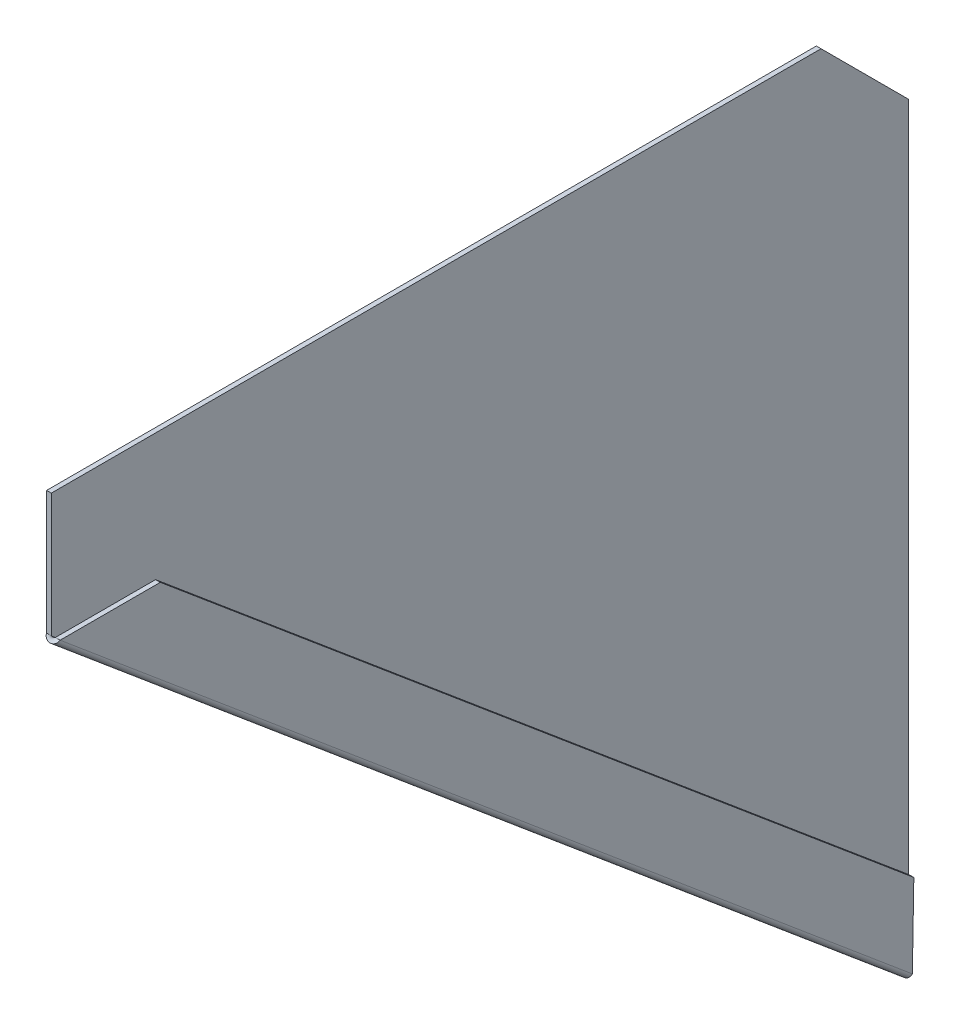
ISO-10303-21;
HEADER;
FILE_DESCRIPTION(('STEP AP214'),'2;1');
FILE_NAME('part.step','',(''),(''),'','','');
FILE_SCHEMA(('AUTOMOTIVE_DESIGN { 1 0 10303 214 1 1 1 1 }'));
ENDSEC;
DATA;
#1=APPLICATION_CONTEXT('core data for automotive mechanical design processes');
#2=APPLICATION_PROTOCOL_DEFINITION('international standard','automotive_design',2000,#1);
#3=PRODUCT_CONTEXT('',#1,'mechanical');
#4=PRODUCT('Part','Part','',(#3));
#5=PRODUCT_RELATED_PRODUCT_CATEGORY('part','',(#4));
#6=PRODUCT_DEFINITION_FORMATION('','',#4);
#7=PRODUCT_DEFINITION_CONTEXT('part definition',#1,'design');
#8=PRODUCT_DEFINITION('design','',#6,#7);
#9=PRODUCT_DEFINITION_SHAPE('','',#8);
#10=(LENGTH_UNIT() NAMED_UNIT(*) SI_UNIT(.MILLI.,.METRE.));
#11=(NAMED_UNIT(*) PLANE_ANGLE_UNIT() SI_UNIT($,.RADIAN.));
#12=(NAMED_UNIT(*) SI_UNIT($,.STERADIAN.) SOLID_ANGLE_UNIT());
#13=UNCERTAINTY_MEASURE_WITH_UNIT(LENGTH_MEASURE(1.E-05),#10,'distance_accuracy_value','');
#14=(GEOMETRIC_REPRESENTATION_CONTEXT(3) GLOBAL_UNCERTAINTY_ASSIGNED_CONTEXT((#13)) GLOBAL_UNIT_ASSIGNED_CONTEXT((#10,
#11,#12)) REPRESENTATION_CONTEXT('',''));
#15=CARTESIAN_POINT('',(0.,0.,0.));
#16=DIRECTION('',(0.,0.,1.));
#17=DIRECTION('',(1.,0.,0.));
#18=AXIS2_PLACEMENT_3D('',#15,#16,#17);
#19=CARTESIAN_POINT('',(0.0500000000000001,-98.1807021685568,-0.42423982239314));
#20=DIRECTION('',(0.,-0.642787609686543,-0.766044443118975));
#21=DIRECTION('',(1.,0.,0.));
#22=AXIS2_PLACEMENT_3D('',#19,#20,#21);
#23=CYLINDRICAL_SURFACE('',#22,0.66);
#24=DIRECTION('',(0.,-0.642787609686543,-0.766044443118975));
#25=VECTOR('',#24,1.);
#26=CARTESIAN_POINT('',(-0.61,-98.1807021685569,-0.424239822393022));
#27=LINE('',#26,#25);
#28=CARTESIAN_POINT('',(-0.61,-97.6594680818817,0.19694277298478));
#29=VERTEX_POINT('',#28);
#30=CARTESIAN_POINT('',(-0.61,-4.68466362937705,111.));
#31=VERTEX_POINT('',#30);
#32=EDGE_CURVE('E174',#29,#31,#27,.F.);
#33=ORIENTED_EDGE('',*,*,#32,.F.);
#34=CARTESIAN_POINT('',(0.05,-97.6594680818816,0.196942772984869));
#35=DIRECTION('',(0.,0.642787609686577,0.766044443118946));
#36=DIRECTION('',(0.,0.766044443118947,-0.642787609686577));
#37=AXIS2_PLACEMENT_3D('',#34,#35,#36);
#38=CIRCLE('',#37,0.66);
#39=CARTESIAN_POINT('',(0.71,-97.6594680818814,0.196942772984787));
#40=VERTEX_POINT('',#39);
#41=EDGE_CURVE('E142',#29,#40,#38,.T.);
#42=ORIENTED_EDGE('',*,*,#41,.T.);
#43=DIRECTION('',(0.,0.642787609686543,0.766044443118975));
#44=VECTOR('',#43,1.);
#45=CARTESIAN_POINT('',(0.71,-51.6106726382172,55.0757601776069));
#46=LINE('',#45,#44);
#47=CARTESIAN_POINT('',(0.71,-5.04064310787757,110.575760177607));
#48=VERTEX_POINT('',#47);
#49=EDGE_CURVE('E260',#40,#48,#46,.T.);
#50=ORIENTED_EDGE('',*,*,#49,.T.);
#51=CARTESIAN_POINT('',(-0.61,-4.68466362937643,111.));
#52=CARTESIAN_POINT('',(-0.6100002290786,-4.69479038362159,111.004732032463));
#53=CARTESIAN_POINT('',(-0.609734955302619,-4.70491712293474,111.009464052396));
#54=CARTESIAN_POINT('',(-0.608675046888262,-4.72515067993828,111.018911376037));
#55=CARTESIAN_POINT('',(-0.607880412249888,-4.73525749762867,111.023626679744));
#56=CARTESIAN_POINT('',(-0.605763426957518,-4.75543131962795,111.033023879765));
#57=CARTESIAN_POINT('',(-0.604441076303522,-4.76549832393683,111.037705776079));
#58=CARTESIAN_POINT('',(-0.601271916850145,-4.78557273618793,111.047019561417));
#59=CARTESIAN_POINT('',(-0.599425108050763,-4.79558014413014,111.051651450441));
#60=CARTESIAN_POINT('',(-0.595211462081707,-4.81551572078987,111.060848738885));
#61=CARTESIAN_POINT('',(-0.592844624912034,-4.82544388950738,111.065414138305));
#62=CARTESIAN_POINT('',(-0.587596629305016,-4.84520153667719,111.07446212618));
#63=CARTESIAN_POINT('',(-0.584715470867671,-4.85503101512948,111.078944714635));
#64=CARTESIAN_POINT('',(-0.578445772299144,-4.87457206823442,111.08781095851));
#65=CARTESIAN_POINT('',(-0.575057232167962,-4.88428364288708,111.09219461393));
#66=CARTESIAN_POINT('',(-0.56778093387397,-4.90356995896519,111.100847108059));
#67=CARTESIAN_POINT('',(-0.56389317571116,-4.91314470039065,111.105115946769));
#68=CARTESIAN_POINT('',(-0.555627807204121,-4.93213875021231,111.113523200391));
#69=CARTESIAN_POINT('',(-0.551250196859892,-4.94155805860852,111.117661615303));
#70=CARTESIAN_POINT('',(-0.542015670063483,-4.96022301702613,111.125792728449));
#71=CARTESIAN_POINT('',(-0.537158753611303,-4.96946866704753,111.129785426683));
#72=CARTESIAN_POINT('',(-0.526977315328988,-4.98776850172695,111.137610164635));
#73=CARTESIAN_POINT('',(-0.521652793498854,-4.99682268638497,111.141442204353));
#74=CARTESIAN_POINT('',(-0.510548971702005,-5.01472224460621,111.148931070476));
#75=CARTESIAN_POINT('',(-0.504769671735292,-5.02356761816944,111.152587896881));
#76=CARTESIAN_POINT('',(-0.492770216504601,-5.04103271151383,111.159712203687));
#77=CARTESIAN_POINT('',(-0.486550061240624,-5.04965243129499,111.163179684087));
#78=CARTESIAN_POINT('',(-0.473683880314394,-5.06664991800772,111.16991162234));
#79=CARTESIAN_POINT('',(-0.46703785465214,-5.07502768493929,111.173176080194));
#80=CARTESIAN_POINT('',(-0.453335943787267,-5.09152554977088,111.179488785911));
#81=CARTESIAN_POINT('',(-0.446280058584647,-5.09964564767091,111.182537033775));
#82=CARTESIAN_POINT('',(-0.431775426884523,-5.11561307900479,111.18840465294));
#83=CARTESIAN_POINT('',(-0.424326680387018,-5.12346041243864,111.191224024241));
#84=CARTESIAN_POINT('',(-0.409054270779871,-5.13886787651896,111.19662177509));
#85=CARTESIAN_POINT('',(-0.401230607670227,-5.14642800716543,111.199200154638));
#86=CARTESIAN_POINT('',(-0.385227212728506,-5.16124731924654,111.204104387361));
#87=CARTESIAN_POINT('',(-0.377047480896428,-5.16850650068117,111.206430240536));
#88=CARTESIAN_POINT('',(-0.360351654200277,-5.18271089292706,111.210818494253));
#89=CARTESIAN_POINT('',(-0.351835559336204,-5.18965610373832,111.212880894794));
#90=CARTESIAN_POINT('',(-0.334487522594516,-5.20322028970873,111.21673195166));
#91=CARTESIAN_POINT('',(-0.3256555807169,-5.20983926486789,111.218520607986));
#92=CARTESIAN_POINT('',(-0.307697126869697,-5.2227395004356,111.221814544315));
#93=CARTESIAN_POINT('',(-0.29857061490011,-5.22902076084415,111.223319824318));
#94=CARTESIAN_POINT('',(-0.280045007435681,-5.24123490139656,111.226038058572));
#95=CARTESIAN_POINT('',(-0.270645911940838,-5.24716778154042,111.227251012824));
#96=CARTESIAN_POINT('',(-0.251597780670221,-5.25867533532795,111.229376350384));
#97=CARTESIAN_POINT('',(-0.241948744894446,-5.26425000897163,111.230288733694));
#98=CARTESIAN_POINT('',(-0.222423978434286,-5.27503218647409,111.231805408281));
#99=CARTESIAN_POINT('',(-0.212548247749902,-5.28023969033287,111.232409699559));
#100=CARTESIAN_POINT('',(-0.192593882972773,-5.29027944952509,111.233303411216));
#101=CARTESIAN_POINT('',(-0.182515248880028,-5.29511170485852,111.233592831595));
#102=CARTESIAN_POINT('',(-0.162179357598472,-5.30439379226605,111.233850781137));
#103=CARTESIAN_POINT('',(-0.151922100409662,-5.30884362434013,111.2338193103));
#104=CARTESIAN_POINT('',(-0.131253673566991,-5.31735461178621,111.233430230149));
#105=CARTESIAN_POINT('',(-0.120842503913131,-5.32141576715821,111.233072620835));
#106=CARTESIAN_POINT('',(-0.0998913335599486,-5.32914408411346,111.232026802163));
#107=CARTESIAN_POINT('',(-0.0893513328606269,-5.3328112456967,111.231338592806));
#108=CARTESIAN_POINT('',(-0.0681678922014206,-5.33974720715347,111.229627908928));
#109=CARTESIAN_POINT('',(-0.057524452241536,-5.343016007027,111.228605434407));
#110=CARTESIAN_POINT('',(-0.0361597740403055,-5.34915183683146,111.226223360355));
#111=CARTESIAN_POINT('',(-0.0254385357989597,-5.3520188667624,111.224863760823));
#112=CARTESIAN_POINT('',(-0.00394408943681063,-5.35734871634793,111.221805389067));
#113=CARTESIAN_POINT('',(0.00682911868399253,-5.35981153600252,111.220106616841));
#114=CARTESIAN_POINT('',(0.0284015512030749,-5.3643314984795,111.21636866911));
#115=CARTESIAN_POINT('',(0.0392007756013541,-5.36638864130189,111.214329493605));
#116=CARTESIAN_POINT('',(0.0607992243979131,-5.37009676086962,111.209910328788));
#117=CARTESIAN_POINT('',(0.0715984487961929,-5.37174773761496,111.207530339477));
#118=CARTESIAN_POINT('',(0.0931708813152771,-5.37464401427344,111.202429957575));
#119=CARTESIAN_POINT('',(0.103944089436082,-5.37588931418658,111.199709564984));
#120=CARTESIAN_POINT('',(0.125438535798231,-5.37797570373648,111.193929607107));
#121=CARTESIAN_POINT('',(0.136159774039577,-5.37881679337324,111.190870041822));
#122=CARTESIAN_POINT('',(0.157524452240813,-5.38009720270424,111.184413786241));
#123=CARTESIAN_POINT('',(0.168167892200703,-5.38053652239846,111.181017095946));
#124=CARTESIAN_POINT('',(0.189351332859912,-5.38101680007715,111.17388945019));
#125=CARTESIAN_POINT('',(0.199891333559232,-5.3810577580616,111.170158494731));
#126=CARTESIAN_POINT('',(0.22084250391242,-5.38074568024181,111.162365983769));
#127=CARTESIAN_POINT('',(0.231253673566288,-5.38039264443755,111.158304428267));
#128=CARTESIAN_POINT('',(0.251922100408966,-5.37929789612692,111.149855178785));
#129=CARTESIAN_POINT('',(0.262179357597776,-5.37855618362054,111.145467484805));
#130=CARTESIAN_POINT('',(0.28251524887934,-5.37669033534847,111.13637120563));
#131=CARTESIAN_POINT('',(0.292593882972095,-5.37556619958278,111.131662620435));
#132=CARTESIAN_POINT('',(0.312548247749233,-5.37294267952603,111.121930579145));
#133=CARTESIAN_POINT('',(0.322423978433616,-5.37144329523496,111.11690712305));
#134=CARTESIAN_POINT('',(0.341948744893785,-5.36807735686794,111.106552118829));
#135=CARTESIAN_POINT('',(0.35159778066957,-5.36621080279198,111.101220570703));
#136=CARTESIAN_POINT('',(0.370645911940203,-5.36211948813989,111.09025690351));
#137=CARTESIAN_POINT('',(0.380045007435049,-5.35989472756377,111.084624784442));
#138=CARTESIAN_POINT('',(0.398570614899487,-5.35509682614682,111.073068220554));
#139=CARTESIAN_POINT('',(0.407697126869078,-5.35252368530599,111.067143775734));
#140=CARTESIAN_POINT('',(0.425655580716296,-5.34703968887372,111.055011509772));
#141=CARTESIAN_POINT('',(0.434487522593923,-5.34412883328228,111.04880368863));
#142=CARTESIAN_POINT('',(0.451835559335625,-5.3379808864473,111.03611430213));
#143=CARTESIAN_POINT('',(0.460351654199701,-5.33474379520376,111.029632736773));
#144=CARTESIAN_POINT('',(0.477047480895865,-5.32795564209333,111.016406153423));
#145=CARTESIAN_POINT('',(0.485227212727953,-5.32440458022642,111.009661135431));
#146=CARTESIAN_POINT('',(0.501230607669694,-5.31700150728077,110.995918573075));
#147=CARTESIAN_POINT('',(0.509054270779347,-5.31314949620201,110.98892102871));
#148=CARTESIAN_POINT('',(0.524326680386511,-5.30515827125714,110.974684948228));
#149=CARTESIAN_POINT('',(0.531775426884022,-5.30101905739102,110.96744641211));
#150=CARTESIAN_POINT('',(0.546280058584163,-5.29246786519259,110.952740463312));
#151=CARTESIAN_POINT('',(0.553335943786792,-5.28805588686027,110.945273050632));
#152=CARTESIAN_POINT('',(0.567037854651685,-5.27897426116411,110.930122015281));
#153=CARTESIAN_POINT('',(0.573683880313948,-5.27430461380028,110.922438392612));
#154=CARTESIAN_POINT('',(0.586550061240198,-5.26472336622301,110.906868124725));
#155=CARTESIAN_POINT('',(0.592770216504185,-5.25981176600958,110.898981479508));
#156=CARTESIAN_POINT('',(0.604769671734895,-5.24976291180064,110.88301884307));
#157=CARTESIAN_POINT('',(0.610548971701618,-5.24462565780512,110.874942851848));
#158=CARTESIAN_POINT('',(0.621652793498487,-5.2341423387193,110.858615656091));
#159=CARTESIAN_POINT('',(0.626977315328634,-5.22879627362899,110.850364451556));
#160=CARTESIAN_POINT('',(0.637158753610969,-5.21791267808502,110.833701383971));
#161=CARTESIAN_POINT('',(0.642015670063157,-5.21237514763134,110.825289520921));
#162=CARTESIAN_POINT('',(0.651250196859588,-5.20112642834919,110.808320078142));
#163=CARTESIAN_POINT('',(0.65562780720383,-5.19541523952071,110.799762498413));
#164=CARTESIAN_POINT('',(0.663893175710892,-5.18383742883448,110.782516915158));
#165=CARTESIAN_POINT('',(0.667780933873713,-5.17797080697673,110.773828911632));
#166=CARTESIAN_POINT('',(0.675057232167726,-5.16610073003404,110.756338087869));
#167=CARTESIAN_POINT('',(0.678445772298918,-5.1600972749491,110.747535267632));
#168=CARTESIAN_POINT('',(0.684715470867469,-5.14797246097958,110.729830694124));
#169=CARTESIAN_POINT('',(0.687596629304827,-5.141851102095,110.720928940853));
#170=CARTESIAN_POINT('',(0.692844624911869,-5.12950969406065,110.703042623345));
#171=CARTESIAN_POINT('',(0.695211462081552,-5.12328964491087,110.694058059108));
#172=CARTESIAN_POINT('',(0.69942510805063,-5.11077030738658,110.676022441031));
#173=CARTESIAN_POINT('',(0.701271916850025,-5.10447101901207,110.66697138719));
#174=CARTESIAN_POINT('',(0.704441076303427,-5.09181284589641,110.648819272219));
#175=CARTESIAN_POINT('',(0.705763426957434,-5.08545396115526,110.639718211089));
#176=CARTESIAN_POINT('',(0.707880412249828,-5.07269637829141,110.621482681435));
#177=CARTESIAN_POINT('',(0.708675046888214,-5.06629768016873,110.612348212911));
#178=CARTESIAN_POINT('',(0.709734955302595,-5.0534803623006,110.594062559637));
#179=CARTESIAN_POINT('',(0.710000229078589,-5.04706174255517,110.584911374887));
#180=CARTESIAN_POINT('',(0.71,-5.04064310787776,110.575760177607));
#181=B_SPLINE_CURVE_WITH_KNOTS('',3,(#51,#52,#53,#54,#55,#56,#57,#58,#59,#60,#61,#62,#63,#64,
#65,#66,#67,#68,#69,#70,#71,#72,#73,#74,#75,#76,#77,#78,#79,#80,#81,#82,#83,#84,#85,#86,#87,#88,
#89,#90,#91,#92,#93,#94,#95,#96,#97,#98,#99,#100,#101,#102,#103,#104,#105,#106,#107,#108,#109,
#110,#111,#112,#113,#114,#115,#116,#117,#118,#119,#120,#121,#122,#123,#124,#125,#126,#127,#128,
#129,#130,#131,#132,#133,#134,#135,#136,#137,#138,#139,#140,#141,#142,#143,#144,#145,#146,#147,
#148,#149,#150,#151,#152,#153,#154,#155,#156,#157,#158,#159,#160,#161,#162,#163,#164,#165,#166,
#167,#168,#169,#170,#171,#172,#173,#174,#175,#176,#177,#178,#179,#180),.UNSPECIFIED.,.F.,.F.,(4,
2,2,2,2,2,2,2,2,2,2,2,2,2,2,2,2,2,2,2,2,2,2,2,2,2,2,2,2,2,2,2,2,2,2,2,2,2,2,2,2,2,2,2,2,2,2,2,2,
2,2,2,2,2,2,2,2,2,2,2,2,2,2,2,4),(0.,0.0335302353550578,0.0670604707101002,0.100590706065136,
0.134120941420187,0.167651176775227,0.201181412130282,0.23471164748533,0.268241882840361,
0.30177211819542,0.335302353550455,0.3688325889055,0.402362824260545,0.435893059615595,
0.46942329497064,0.50295353032569,0.536483765680734,0.570014001035782,0.603544236390835,
0.637074471745877,0.670604707100919,0.704134942455965,0.737665177811005,0.77119541316606,
0.804725648521099,0.838255883876155,0.871786119231193,0.905316354586247,0.938846589941286,
0.972376825296341,1.00590706065138,1.03943729600642,1.07296753136147,1.10649776671652,
1.14002800207156,1.1735582374266,1.20708847278166,1.2406187081367,1.27414894349175,
1.30767917884679,1.34120941420184,1.37473964955689,1.40826988491193,1.44180012026697,
1.47533035562203,1.50886059097707,1.54239082633212,1.57592106168717,1.6094512970422,
1.64298153239725,1.6765117677523,1.71004200310734,1.74357223846239,1.77710247381744,
1.81063270917249,1.84416294452754,1.87769317988258,1.91122341523762,1.94475365059268,
1.97828388594771,2.01181412130277,2.04534435665781,2.07887459201285,2.11240482736789,
2.14593506272294),.UNSPECIFIED.);
#182=EDGE_CURVE('E243',#31,#48,#181,.T.);
#183=ORIENTED_EDGE('',*,*,#182,.F.);
#184=EDGE_LOOP('',(#33,#42,#50,#183));
#185=FACE_BOUND('',#184,.T.);
#186=ADVANCED_FACE('F42',(#185),#23,.T.);
#187=CARTESIAN_POINT('',(0.0500000000000001,-98.1807021685568,-0.42423982239314));
#188=DIRECTION('',(0.,-0.642787609686543,-0.766044443118975));
#189=DIRECTION('',(1.,0.,0.));
#190=AXIS2_PLACEMENT_3D('',#187,#188,#189);
#191=CYLINDRICAL_SURFACE('',#190,0.05);
#192=CARTESIAN_POINT('',(0.05,-97.6594680818816,0.196942772984862));
#193=DIRECTION('',(0.,0.642787609686543,0.766044443118975));
#194=DIRECTION('',(0.,-0.766044443118975,0.642787609686543));
#195=AXIS2_PLACEMENT_3D('',#192,#193,#194);
#196=CIRCLE('',#195,0.05);
#197=CARTESIAN_POINT('',(0.,-97.6594680818815,0.196942772984808));
#198=VERTEX_POINT('',#197);
#199=CARTESIAN_POINT('',(0.1,-97.6594680818814,0.196942772984759));
#200=VERTEX_POINT('',#199);
#201=EDGE_CURVE('E139',#198,#200,#196,.T.);
#202=ORIENTED_EDGE('',*,*,#201,.F.);
#203=DIRECTION('',(0.,-0.642787609686543,-0.766044443118975));
#204=VECTOR('',#203,1.);
#205=CARTESIAN_POINT('',(0.,-98.1807021685568,-0.424239822393132));
#206=LINE('',#205,#204);
#207=CARTESIAN_POINT('',(0.,-4.68466362937694,111.));
#208=VERTEX_POINT('',#207);
#209=EDGE_CURVE('E154',#198,#208,#206,.F.);
#210=ORIENTED_EDGE('',*,*,#209,.T.);
#211=CARTESIAN_POINT('',(0.,-4.68466362937682,111.));
#212=CARTESIAN_POINT('',(-4.36261635787755E-06,-4.6945873870513,110.993265728248));
#213=CARTESIAN_POINT('',(0.000321140730506063,-4.70450999333328,110.986530490363));
#214=CARTESIAN_POINT('',(0.00160033122915463,-4.72425948594163,110.972979696014));
#215=CARTESIAN_POINT('',(0.00255401838093844,-4.734086372268,110.96616413955));
#216=CARTESIAN_POINT('',(0.00505802836790537,-4.75355100779452,110.952374321728));
#217=CARTESIAN_POINT('',(0.00660835120308924,-4.76318875699467,110.945400060371));
#218=CARTESIAN_POINT('',(0.0102446875666167,-4.78218995517346,110.931221372442));
#219=CARTESIAN_POINT('',(0.0123307010949606,-4.7915534041521,110.92401694587));
#220=CARTESIAN_POINT('',(0.0169586207863325,-4.80993111589391,110.909315090701));
#221=CARTESIAN_POINT('',(0.0195005269493599,-4.81894537865709,110.901817662105));
#222=CARTESIAN_POINT('',(0.0249424497486277,-4.83656332177222,110.886478285362));
#223=CARTESIAN_POINT('',(0.0278424663848683,-4.84516700212417,110.878636337215));
#224=CARTESIAN_POINT('',(0.0338891903785647,-4.86191814370423,110.862569627624));
#225=CARTESIAN_POINT('',(0.0370358977360204,-4.87006560493234,110.854344866179));
#226=CARTESIAN_POINT('',(0.0434550700623086,-4.88587620890409,110.837488951828));
#227=CARTESIAN_POINT('',(0.0467275350311411,-4.89353935164775,110.828857798921));
#228=CARTESIAN_POINT('',(0.0532724649688044,-4.90837182991862,110.811181139655));
#229=CARTESIAN_POINT('',(0.0565449299376353,-4.91554116544585,110.802135633295));
#230=CARTESIAN_POINT('',(0.0629641022639247,-4.92939551801583,110.783638229114));
#231=CARTESIAN_POINT('',(0.0661108096213832,-4.93608053505858,110.774186331292));
#232=CARTESIAN_POINT('',(0.072157533615083,-4.94899435002026,110.754899722351));
#233=CARTESIAN_POINT('',(0.075057550251324,-4.95522314793917,110.745065011231));
#234=CARTESIAN_POINT('',(0.0804994730505953,-4.96727016136577,110.725051069441));
#235=CARTESIAN_POINT('',(0.083041379213626,-4.97308837687346,110.714871838771));
#236=CARTESIAN_POINT('',(0.0876692989050037,-4.98437562167338,110.694220375407));
#237=CARTESIAN_POINT('',(0.0897553124333498,-4.98984465096562,110.683748142712));
#238=CARTESIAN_POINT('',(0.0933916487968828,-5.00050840932857,110.662573512109));
#239=CARTESIAN_POINT('',(0.09494197163207,-5.00570313839929,110.651871114199));
#240=CARTESIAN_POINT('',(0.0974459816190437,-5.01590345941449,110.630307613488));
#241=CARTESIAN_POINT('',(0.098399668770831,-5.02090905135899,110.619446510686));
#242=CARTESIAN_POINT('',(0.0996788592694868,-5.03082451529237,110.597643986503));
#243=CARTESIAN_POINT('',(0.100004362616354,-5.03573438728125,110.586702565121));
#244=CARTESIAN_POINT('',(0.1,-5.04064310787764,110.575760177607));
#245=B_SPLINE_CURVE_WITH_KNOTS('',3,(#211,#212,#213,#214,#215,#216,#217,#218,#219,#220,#221,
#222,#223,#224,#225,#226,#227,#228,#229,#230,#231,#232,#233,#234,#235,#236,#237,#238,#239,#240,
#241,#242,#243,#244),.UNSPECIFIED.,.F.,.F.,(4,2,2,2,2,2,2,2,2,2,2,2,2,2,2,2,4),(0.,
0.0359739302906176,0.0719478605811885,0.107921790871804,0.143895721162437,0.179869651453019,
0.215843581743635,0.251817512034245,0.287791442324852,0.323765372615469,0.359739302906064,
0.395713233196684,0.431687163487257,0.467661093777897,0.50363502406852,0.539608954359092,
0.575582884649711),.UNSPECIFIED.);
#246=CARTESIAN_POINT('',(0.1,-5.04064310787765,110.575760177607));
#247=VERTEX_POINT('',#246);
#248=EDGE_CURVE('E171',#208,#247,#245,.T.);
#249=ORIENTED_EDGE('',*,*,#248,.T.);
#250=DIRECTION('',(0.,0.642787609686543,0.766044443118975));
#251=VECTOR('',#250,1.);
#252=CARTESIAN_POINT('',(0.1,-51.6106726382172,55.0757601776069));
#253=LINE('',#252,#251);
#254=EDGE_CURVE('E156',#200,#247,#253,.T.);
#255=ORIENTED_EDGE('',*,*,#254,.F.);
#256=EDGE_LOOP('',(#202,#210,#249,#255));
#257=FACE_BOUND('',#256,.T.);
#258=ADVANCED_FACE('F151',(#257),#191,.F.);
#259=CARTESIAN_POINT('',(-0.61,-98.6862915010153,0.));
#260=DIRECTION('',(0.,0.,-1.));
#261=DIRECTION('',(-1.,0.,0.));
#262=AXIS2_PLACEMENT_3D('',#259,#260,#261);
#263=PLANE('',#262);
#264=DIRECTION('',(0.,1.,0.));
#265=VECTOR('',#264,1.);
#266=CARTESIAN_POINT('',(0.,-98.6862915010153,0.));
#267=LINE('',#266,#265);
#268=CARTESIAN_POINT('',(0.,-86.9376258970247,0.));
#269=VERTEX_POINT('',#268);
#270=CARTESIAN_POINT('',(0.,0.,0.));
#271=VERTEX_POINT('',#270);
#272=EDGE_CURVE('E267',#269,#271,#267,.T.);
#273=ORIENTED_EDGE('',*,*,#272,.F.);
#274=DIRECTION('',(-1.,0.,0.));
#275=VECTOR('',#274,1.);
#276=CARTESIAN_POINT('',(0.,-86.9376258970247,0.));
#277=LINE('',#276,#275);
#278=CARTESIAN_POINT('',(-0.61,-86.9376258970247,0.));
#279=VERTEX_POINT('',#278);
#280=EDGE_CURVE('E284',#279,#269,#277,.F.);
#281=ORIENTED_EDGE('',*,*,#280,.F.);
#282=DIRECTION('',(0.,1.,0.));
#283=VECTOR('',#282,1.);
#284=CARTESIAN_POINT('',(-0.61,-98.6862915010153,0.));
#285=LINE('',#284,#283);
#286=CARTESIAN_POINT('',(-0.61,0.,0.));
#287=VERTEX_POINT('',#286);
#288=EDGE_CURVE('E82',#279,#287,#285,.T.);
#289=ORIENTED_EDGE('',*,*,#288,.T.);
#290=DIRECTION('',(1.,0.,0.));
#291=VECTOR('',#290,1.);
#292=CARTESIAN_POINT('',(-0.61,0.,0.));
#293=LINE('',#292,#291);
#294=EDGE_CURVE('E46',#287,#271,#293,.T.);
#295=ORIENTED_EDGE('',*,*,#294,.T.);
#296=EDGE_LOOP('',(#273,#281,#289,#295));
#297=FACE_BOUND('',#296,.T.);
#298=ADVANCED_FACE('F44',(#297),#263,.T.);
#299=CARTESIAN_POINT('',(-0.61,0.,0.));
#300=DIRECTION('',(1.,0.,0.));
#301=DIRECTION('',(0.,0.,-1.));
#302=AXIS2_PLACEMENT_3D('',#299,#300,#301);
#303=PLANE('',#302);
#304=DIRECTION('',(0.,0.999840191284591,-0.0178771332151613));
#305=VECTOR('',#304,1.);
#306=CARTESIAN_POINT('',(-0.61,-0.0276909646369503,-1.54871248349723));
#307=LINE('',#306,#305);
#308=CARTESIAN_POINT('',(-0.61,-86.9332970360809,0.00515893558170207));
#309=VERTEX_POINT('',#308);
#310=EDGE_CURVE('E290',#29,#309,#307,.T.);
#311=ORIENTED_EDGE('',*,*,#310,.F.);
#312=ORIENTED_EDGE('',*,*,#32,.T.);
#313=DIRECTION('',(0.,-1.,0.));
#314=VECTOR('',#313,1.);
#315=CARTESIAN_POINT('',(-0.61,11.3137084989847,111.));
#316=LINE('',#315,#314);
#317=CARTESIAN_POINT('',(-0.61,11.3137084989847,111.));
#318=VERTEX_POINT('',#317);
#319=EDGE_CURVE('E273',#318,#31,#316,.T.);
#320=ORIENTED_EDGE('',*,*,#319,.F.);
#321=DIRECTION('',(0.,0.,1.));
#322=VECTOR('',#321,1.);
#323=CARTESIAN_POINT('',(-0.61,11.3137084989847,11.3137084989848));
#324=LINE('',#323,#322);
#325=CARTESIAN_POINT('',(-0.61,11.3137084989847,11.3137084989848));
#326=VERTEX_POINT('',#325);
#327=EDGE_CURVE('E271',#326,#318,#324,.T.);
#328=ORIENTED_EDGE('',*,*,#327,.F.);
#329=DIRECTION('',(0.,0.707106781186546,0.707106781186549));
#330=VECTOR('',#329,1.);
#331=CARTESIAN_POINT('',(-0.61,0.,0.));
#332=LINE('',#331,#330);
#333=EDGE_CURVE('E269',#287,#326,#332,.T.);
#334=ORIENTED_EDGE('',*,*,#333,.F.);
#335=ORIENTED_EDGE('',*,*,#288,.F.);
#336=DIRECTION('',(0.,-0.642787609686543,-0.766044443118975));
#337=VECTOR('',#336,1.);
#338=CARTESIAN_POINT('',(-0.61,-51.0170931023658,42.8084240059325));
#339=LINE('',#338,#337);
#340=EDGE_CURVE('E166',#309,#279,#339,.T.);
#341=ORIENTED_EDGE('',*,*,#340,.F.);
#342=EDGE_LOOP('',(#311,#312,#320,#328,#334,#335,#341));
#343=FACE_BOUND('',#342,.T.);
#344=ADVANCED_FACE('F221',(#343),#303,.F.);
#345=CARTESIAN_POINT('',(0.,0.,0.));
#346=DIRECTION('',(1.,0.,0.));
#347=DIRECTION('',(0.,0.,-1.));
#348=AXIS2_PLACEMENT_3D('',#345,#346,#347);
#349=PLANE('',#348);
#350=ORIENTED_EDGE('',*,*,#209,.F.);
#351=DIRECTION('',(0.,0.999840191284591,-0.0178771332151613));
#352=VECTOR('',#351,1.);
#353=CARTESIAN_POINT('',(0.,-0.0276909646369503,-1.54871248349723));
#354=LINE('',#353,#352);
#355=CARTESIAN_POINT('',(0.,-86.9332970360809,0.00515893558170207));
#356=VERTEX_POINT('',#355);
#357=EDGE_CURVE('E160',#198,#356,#354,.T.);
#358=ORIENTED_EDGE('',*,*,#357,.T.);
#359=DIRECTION('',(0.,-0.642787609686543,-0.766044443118975));
#360=VECTOR('',#359,1.);
#361=CARTESIAN_POINT('',(0.,-51.0170931023658,42.8084240059325));
#362=LINE('',#361,#360);
#363=EDGE_CURVE('E165',#356,#269,#362,.T.);
#364=ORIENTED_EDGE('',*,*,#363,.T.);
#365=ORIENTED_EDGE('',*,*,#272,.T.);
#366=DIRECTION('',(0.,0.707106781186546,0.707106781186549));
#367=VECTOR('',#366,1.);
#368=CARTESIAN_POINT('',(0.,0.,0.));
#369=LINE('',#368,#367);
#370=CARTESIAN_POINT('',(0.,11.3137084989847,11.3137084989848));
#371=VERTEX_POINT('',#370);
#372=EDGE_CURVE('E276',#271,#371,#369,.T.);
#373=ORIENTED_EDGE('',*,*,#372,.T.);
#374=DIRECTION('',(0.,0.,1.));
#375=VECTOR('',#374,1.);
#376=CARTESIAN_POINT('',(0.,11.3137084989847,11.3137084989848));
#377=LINE('',#376,#375);
#378=CARTESIAN_POINT('',(0.,11.3137084989847,111.));
#379=VERTEX_POINT('',#378);
#380=EDGE_CURVE('E279',#371,#379,#377,.T.);
#381=ORIENTED_EDGE('',*,*,#380,.T.);
#382=DIRECTION('',(0.,-1.,0.));
#383=VECTOR('',#382,1.);
#384=CARTESIAN_POINT('',(0.,11.3137084989847,111.));
#385=LINE('',#384,#383);
#386=EDGE_CURVE('E169',#379,#208,#385,.T.);
#387=ORIENTED_EDGE('',*,*,#386,.T.);
#388=EDGE_LOOP('',(#350,#358,#364,#365,#373,#381,#387));
#389=FACE_BOUND('',#388,.T.);
#390=ADVANCED_FACE('F168',(#389),#349,.T.);
#391=CARTESIAN_POINT('',(0.71,-45.221861982605,49.7149115128211));
#392=DIRECTION('',(0.,-0.766044443118975,0.642787609686543));
#393=DIRECTION('',(0.,-0.642787609686543,-0.766044443118975));
#394=AXIS2_PLACEMENT_3D('',#391,#392,#393);
#395=PLANE('',#394);
#396=DIRECTION('',(0.,-0.642787609686543,-0.766044443118975));
#397=VECTOR('',#396,1.);
#398=CARTESIAN_POINT('',(0.71,-45.221861982605,49.7149115128211));
#399=LINE('',#398,#397);
#400=CARTESIAN_POINT('',(0.71,-5.04064310787756,97.6010234615913));
#401=VERTEX_POINT('',#400);
#402=CARTESIAN_POINT('',(0.71,-86.9332970360809,0.00515893558170066));
#403=VERTEX_POINT('',#402);
#404=EDGE_CURVE('E256',#401,#403,#399,.T.);
#405=ORIENTED_EDGE('',*,*,#404,.T.);
#406=DIRECTION('',(-1.,0.,0.));
#407=VECTOR('',#406,1.);
#408=CARTESIAN_POINT('',(0.71,-86.9332970360809,0.00515893558170066));
#409=LINE('',#408,#407);
#410=CARTESIAN_POINT('',(0.1,-86.9332970360809,0.00515893558170055));
#411=VERTEX_POINT('',#410);
#412=EDGE_CURVE('E297',#411,#403,#409,.F.);
#413=ORIENTED_EDGE('',*,*,#412,.F.);
#414=DIRECTION('',(0.,-0.642787609686543,-0.766044443118975));
#415=VECTOR('',#414,1.);
#416=CARTESIAN_POINT('',(0.1,-45.221861982605,49.7149115128211));
#417=LINE('',#416,#415);
#418=CARTESIAN_POINT('',(0.1,-5.04064310787756,97.6010234615913));
#419=VERTEX_POINT('',#418);
#420=EDGE_CURVE('E262',#419,#411,#417,.T.);
#421=ORIENTED_EDGE('',*,*,#420,.F.);
#422=DIRECTION('',(1.,0.,0.));
#423=VECTOR('',#422,1.);
#424=CARTESIAN_POINT('',(0.1,-5.04064310787756,97.6010234615913));
#425=LINE('',#424,#423);
#426=EDGE_CURVE('E172',#419,#401,#425,.T.);
#427=ORIENTED_EDGE('',*,*,#426,.T.);
#428=EDGE_LOOP('',(#405,#413,#421,#427));
#429=FACE_BOUND('',#428,.T.);
#430=ADVANCED_FACE('F212',(#429),#395,.F.);
#431=CARTESIAN_POINT('',(0.71,-48.4162673104111,52.395335845214));
#432=DIRECTION('',(1.,0.,0.));
#433=DIRECTION('',(0.,0.,-1.));
#434=AXIS2_PLACEMENT_3D('',#431,#432,#433);
#435=PLANE('',#434);
#436=ORIENTED_EDGE('',*,*,#49,.F.);
#437=DIRECTION('',(0.,0.999840191284591,-0.0178771332151613));
#438=VECTOR('',#437,1.);
#439=CARTESIAN_POINT('',(0.71,-49.3650135379614,-0.666561619978224));
#440=LINE('',#439,#438);
#441=EDGE_CURVE('E294',#40,#403,#440,.T.);
#442=ORIENTED_EDGE('',*,*,#441,.T.);
#443=ORIENTED_EDGE('',*,*,#404,.F.);
#444=DIRECTION('',(0.,0.,-1.));
#445=VECTOR('',#444,1.);
#446=CARTESIAN_POINT('',(0.71,-5.04064310787757,110.575760177607));
#447=LINE('',#446,#445);
#448=EDGE_CURVE('E146',#48,#401,#447,.T.);
#449=ORIENTED_EDGE('',*,*,#448,.F.);
#450=EDGE_LOOP('',(#436,#442,#443,#449));
#451=FACE_BOUND('',#450,.T.);
#452=ADVANCED_FACE('F203',(#451),#435,.T.);
#453=CARTESIAN_POINT('',(0.1,-48.4162673104111,52.395335845214));
#454=DIRECTION('',(1.,0.,0.));
#455=DIRECTION('',(0.,0.,-1.));
#456=AXIS2_PLACEMENT_3D('',#453,#454,#455);
#457=PLANE('',#456);
#458=DIRECTION('',(0.,0.999840191284591,-0.0178771332151613));
#459=VECTOR('',#458,1.);
#460=CARTESIAN_POINT('',(0.1,-49.3650135379614,-0.666561619978224));
#461=LINE('',#460,#459);
#462=EDGE_CURVE('E298',#200,#411,#461,.T.);
#463=ORIENTED_EDGE('',*,*,#462,.F.);
#464=ORIENTED_EDGE('',*,*,#254,.T.);
#465=DIRECTION('',(0.,0.,-1.));
#466=VECTOR('',#465,1.);
#467=CARTESIAN_POINT('',(0.1,-5.04064310787757,110.575760177607));
#468=LINE('',#467,#466);
#469=EDGE_CURVE('E302',#247,#419,#468,.T.);
#470=ORIENTED_EDGE('',*,*,#469,.T.);
#471=ORIENTED_EDGE('',*,*,#420,.T.);
#472=EDGE_LOOP('',(#463,#464,#470,#471));
#473=FACE_BOUND('',#472,.T.);
#474=ADVANCED_FACE('F211',(#473),#457,.F.);
#475=CARTESIAN_POINT('',(-0.61,11.3137084989847,111.));
#476=DIRECTION('',(0.,0.,1.));
#477=DIRECTION('',(1.,0.,0.));
#478=AXIS2_PLACEMENT_3D('',#475,#476,#477);
#479=PLANE('',#478);
#480=DIRECTION('',(-1.,-2.44314605560345E-13,2.0500429541691E-13));
#481=VECTOR('',#480,1.);
#482=CARTESIAN_POINT('',(0.,-4.68466362937703,111.));
#483=LINE('',#482,#481);
#484=EDGE_CURVE('E245',#208,#31,#483,.T.);
#485=ORIENTED_EDGE('',*,*,#484,.F.);
#486=ORIENTED_EDGE('',*,*,#386,.F.);
#487=DIRECTION('',(1.,0.,0.));
#488=VECTOR('',#487,1.);
#489=CARTESIAN_POINT('',(-0.61,11.3137084989847,111.));
#490=LINE('',#489,#488);
#491=EDGE_CURVE('E11',#318,#379,#490,.T.);
#492=ORIENTED_EDGE('',*,*,#491,.F.);
#493=ORIENTED_EDGE('',*,*,#319,.T.);
#494=EDGE_LOOP('',(#485,#486,#492,#493));
#495=FACE_BOUND('',#494,.T.);
#496=ADVANCED_FACE('F216',(#495),#479,.T.);
#497=CARTESIAN_POINT('',(-0.61,11.3137084989847,11.3137084989848));
#498=DIRECTION('',(0.,1.,0.));
#499=DIRECTION('',(0.,0.,1.));
#500=AXIS2_PLACEMENT_3D('',#497,#498,#499);
#501=PLANE('',#500);
#502=ORIENTED_EDGE('',*,*,#380,.F.);
#503=DIRECTION('',(1.,0.,0.));
#504=VECTOR('',#503,1.);
#505=CARTESIAN_POINT('',(-0.61,11.3137084989847,11.3137084989848));
#506=LINE('',#505,#504);
#507=EDGE_CURVE('E52',#326,#371,#506,.T.);
#508=ORIENTED_EDGE('',*,*,#507,.F.);
#509=ORIENTED_EDGE('',*,*,#327,.T.);
#510=ORIENTED_EDGE('',*,*,#491,.T.);
#511=EDGE_LOOP('',(#502,#508,#509,#510));
#512=FACE_BOUND('',#511,.T.);
#513=ADVANCED_FACE('F229',(#512),#501,.T.);
#514=CARTESIAN_POINT('',(-0.61,0.,0.));
#515=DIRECTION('',(0.,0.707106781186549,-0.707106781186546));
#516=DIRECTION('',(0.,0.707106781186546,0.707106781186549));
#517=AXIS2_PLACEMENT_3D('',#514,#515,#516);
#518=PLANE('',#517);
#519=ORIENTED_EDGE('',*,*,#372,.F.);
#520=ORIENTED_EDGE('',*,*,#294,.F.);
#521=ORIENTED_EDGE('',*,*,#333,.T.);
#522=ORIENTED_EDGE('',*,*,#507,.T.);
#523=EDGE_LOOP('',(#519,#520,#521,#522));
#524=FACE_BOUND('',#523,.T.);
#525=ADVANCED_FACE('F201',(#524),#518,.T.);
#526=CARTESIAN_POINT('',(-0.6161,-4.68466362937635,111.));
#527=CARTESIAN_POINT('',(-0.616100000000085,-4.76630304154155,111.038375898298));
#528=CARTESIAN_POINT('',(-0.598763199928915,-4.84788863816888,111.076716872051));
#529=CARTESIAN_POINT('',(-0.53202911328304,-5.00097127313941,111.144923281968));
#530=CARTESIAN_POINT('',(-0.482658083721767,-5.07240598425677,111.174741535407));
#531=CARTESIAN_POINT('',(-0.359349570175694,-5.19653074238988,111.218649401551));
#532=CARTESIAN_POINT('',(-0.28546060282546,-5.24918362350732,111.232707828364));
#533=CARTESIAN_POINT('',(-0.124350265772123,-5.32996985629093,111.240250353871));
#534=CARTESIAN_POINT('',(-0.0371922861069058,-5.35808309391788,111.233717574882));
#535=CARTESIAN_POINT('',(0.137192286106166,-5.38774805045969,111.198364256349));
#536=CARTESIAN_POINT('',(0.224350265771402,-5.38929976937454,111.169543716806));
#537=CARTESIAN_POINT('',(0.385460602824812,-5.36784344967454,111.091294554233));
#538=CARTESIAN_POINT('',(0.459349570174964,-5.34485552509895,111.041882808887));
#539=CARTESIAN_POINT('',(0.582658083721174,-5.28006068004946,110.927268305678));
#540=CARTESIAN_POINT('',(0.632029113282678,-5.23829092547376,110.862096733706));
#541=CARTESIAN_POINT('',(0.698763199928727,-5.14453820358675,110.723183686723));
#542=CARTESIAN_POINT('',(0.716099999999937,-5.09261252519858,110.649495398852));
#543=CARTESIAN_POINT('',(0.7161,-5.04064310787799,110.575760177607));
#544=CARTESIAN_POINT('',(-0.61,-4.68466362937635,111.));
#545=CARTESIAN_POINT('',(-0.610000000000085,-4.76569123046922,111.037862574503));
#546=CARTESIAN_POINT('',(-0.592821966601237,-4.84666552404378,111.075690557439));
#547=CARTESIAN_POINT('',(-0.526699016314077,-4.99861792655911,111.142948589721));
#548=CARTESIAN_POINT('',(-0.477780115983135,-5.06953428664754,111.172331895002));
#549=CARTESIAN_POINT('',(-0.355600835183843,-5.19279400230999,111.215513904328));
#550=CARTESIAN_POINT('',(-0.282388527045194,-5.24510053234296,111.229281708074));
#551=CARTESIAN_POINT('',(-0.122753603677527,-5.32541860751499,111.236431402702));
#552=CARTESIAN_POINT('',(-0.0363937979741147,-5.35341022281486,111.229796570463));
#553=CARTESIAN_POINT('',(0.136393797973382,-5.38307517935666,111.19444325193));
#554=CARTESIAN_POINT('',(0.222753603676813,-5.3847485205986,111.165724765636));
#555=CARTESIAN_POINT('',(0.382388527044552,-5.36376035851018,111.087868433943));
#556=CARTESIAN_POINT('',(0.45560083518312,-5.34111878501906,111.038747311664));
#557=CARTESIAN_POINT('',(0.577780115982548,-5.27718898244023,110.924858665274));
#558=CARTESIAN_POINT('',(0.626699016313718,-5.23593757889345,110.860122041459));
#559=CARTESIAN_POINT('',(0.692821966601051,-5.14331508946165,110.722157372112));
#560=CARTESIAN_POINT('',(0.709999999999937,-5.09200076006738,110.648982020306));
#561=CARTESIAN_POINT('',(0.71,-5.04064310787799,110.575760177607));
#562=CARTESIAN_POINT('',(0.,-4.68466362937682,111.));
#563=CARTESIAN_POINT('',(0.,-4.70451012323621,110.986530194973));
#564=CARTESIAN_POINT('',(0.00130136616657385,-4.72435411153411,110.973059096314));
#565=CARTESIAN_POINT('',(0.00631068058226839,-4.76328326852839,110.945479364964));
#566=CARTESIAN_POINT('',(0.0100166578800689,-4.78236452572485,110.931367854527));
#567=CARTESIAN_POINT('',(0.0192726640012274,-4.81911999432118,110.901964182044));
#568=CARTESIAN_POINT('',(0.0248190509814267,-4.83679141590734,110.886669679066));
#569=CARTESIAN_POINT('',(0.0369126057820067,-4.87029372992106,110.854536285773));
#570=CARTESIAN_POINT('',(0.0434550153049924,-4.88612311251231,110.837696128554));
#571=CARTESIAN_POINT('',(0.0565449846949522,-4.91578806905405,110.802342810021));
#572=CARTESIAN_POINT('',(0.0630873942179393,-4.92962364300454,110.783829648708));
#573=CARTESIAN_POINT('',(0.0751809490185249,-4.95545124207429,110.745256404935));
#574=CARTESIAN_POINT('',(0.0807273359987283,-4.96744477702985,110.72519758938));
#575=CARTESIAN_POINT('',(0.0899833421198971,-4.99001922151699,110.683894624798));
#576=CARTESIAN_POINT('',(0.0936893194177038,-5.00060292086229,110.662652816702));
#577=CARTESIAN_POINT('',(0.0986986338334117,-5.02100367695148,110.619525910986));
#578=CARTESIAN_POINT('',(0.0999999999999982,-5.03082424694771,110.597644165726));
#579=CARTESIAN_POINT('',(0.1,-5.04064310787763,110.575760177607));
#580=CARTESIAN_POINT('',(0.00616100000000007,-4.68466362937682,111.));
#581=CARTESIAN_POINT('',(0.00616099999999542,-4.70389219405316,110.98601173794));
#582=CARTESIAN_POINT('',(0.00730201182752874,-4.72311876626776,110.972022518556));
#583=CARTESIAN_POINT('',(0.0116940785209215,-4.76090638848228,110.943484925794));
#584=CARTESIAN_POINT('',(0.0149434052960873,-4.77946411113953,110.928934117718));
#585=CARTESIAN_POINT('',(0.0230588863429966,-4.81534588684049,110.898797329849));
#586=CARTESIAN_POINT('',(0.0279218475194956,-4.83266749383134,110.883209297573));
#587=CARTESIAN_POINT('',(0.038525234497548,-4.86569696865736,110.850679145092));
#588=CARTESIAN_POINT('',(0.0442614883191114,-4.88140351269826,110.833735914091));
#589=CARTESIAN_POINT('',(0.05573851168084,-4.91106846924,110.798382595558));
#590=CARTESIAN_POINT('',(0.0614747655024047,-4.92502688174084,110.779972508027));
#591=CARTESIAN_POINT('',(0.072078152480462,-4.95132731999829,110.741796023442));
#592=CARTESIAN_POINT('',(0.076941113656966,-4.96367066954916,110.722030737185));
#593=CARTESIAN_POINT('',(0.0850565947038843,-4.98711880693166,110.681460887989));
#594=CARTESIAN_POINT('',(0.088305921479054,-4.99822604081618,110.660658377532));
#595=CARTESIAN_POINT('',(0.0926979881724586,-5.01976833168513,110.618489333229));
#596=CARTESIAN_POINT('',(0.0938389999999988,-5.0302063641652,110.597125653395));
#597=CARTESIAN_POINT('',(0.093839,-5.04064310787763,110.575760177607));
#598=B_SPLINE_SURFACE_WITH_KNOTS('',1,3,((#526,#527,#528,#529,#530,#531,#532,#533,#534,#535,
#536,#537,#538,#539,#540,#541,#542,#543),(#544,#545,#546,#547,#548,#549,#550,#551,#552,#553,
#554,#555,#556,#557,#558,#559,#560,#561),(#562,#563,#564,#565,#566,#567,#568,#569,#570,#571,
#572,#573,#574,#575,#576,#577,#578,#579),(#580,#581,#582,#583,#584,#585,#586,#587,#588,#589,
#590,#591,#592,#593,#594,#595,#596,#597)),.UNSPECIFIED.,.F.,.F.,.F.,(2,1,1,2),(4,2,2,2,2,2,2,2,
4),(-0.01,0.,1.,1.0101),(0.,0.125,0.25,0.375,0.5,0.625,0.75,0.875,1.),.UNSPECIFIED.);
#599=DIRECTION('',(1.,0.,0.));
#600=VECTOR('',#599,1.);
#601=CARTESIAN_POINT('',(0.71,-5.04064310787765,110.575760177607));
#602=LINE('',#601,#600);
#603=CARTESIAN_POINT('',(0.197905304860591,-5.04064310787757,110.575760177607));
#604=VERTEX_POINT('',#603);
#605=EDGE_CURVE('E259',#247,#604,#602,.T.);
#606=DIRECTION('',(1.,0.,0.));
#607=VECTOR('',#606,1.);
#608=CARTESIAN_POINT('',(0.1,-5.04064310787757,110.575760177607));
#609=LINE('',#608,#607);
#610=EDGE_CURVE('E177',#604,#48,#609,.T.);
#611=ORIENTED_EDGE('',*,*,#605,.F.);
#612=ORIENTED_EDGE('',*,*,#248,.F.);
#613=ORIENTED_EDGE('',*,*,#484,.T.);
#614=ORIENTED_EDGE('',*,*,#182,.T.);
#615=ORIENTED_EDGE('',*,*,#610,.F.);
#616=EDGE_LOOP('',(#611,#612,#613,#614,#615));
#617=FACE_BOUND('',#616,.T.);
#618=ADVANCED_FACE('F195',(#617),#598,.F.);
#619=CARTESIAN_POINT('',(0.1,-5.04064310787757,110.575760177607));
#620=DIRECTION('',(0.,-1.,0.));
#621=DIRECTION('',(0.,0.,-1.));
#622=AXIS2_PLACEMENT_3D('',#619,#620,#621);
#623=PLANE('',#622);
#624=ORIENTED_EDGE('',*,*,#448,.T.);
#625=ORIENTED_EDGE('',*,*,#426,.F.);
#626=ORIENTED_EDGE('',*,*,#469,.F.);
#627=ORIENTED_EDGE('',*,*,#605,.T.);
#628=ORIENTED_EDGE('',*,*,#610,.T.);
#629=EDGE_LOOP('',(#624,#625,#626,#627,#628));
#630=FACE_BOUND('',#629,.T.);
#631=ADVANCED_FACE('F200',(#630),#623,.F.);
#632=CARTESIAN_POINT('',(0.71,-49.3650135379614,-0.666561619978224));
#633=DIRECTION('',(0.,0.0178771332151613,0.999840191284591));
#634=DIRECTION('',(0.,0.999840191284591,-0.0178771332151613));
#635=AXIS2_PLACEMENT_3D('',#632,#633,#634);
#636=PLANE('',#635);
#637=DIRECTION('',(-1.,0.,0.));
#638=VECTOR('',#637,1.);
#639=CARTESIAN_POINT('',(0.71,-97.6594680818814,0.196942772984774));
#640=LINE('',#639,#638);
#641=EDGE_CURVE('E291',#200,#40,#640,.F.);
#642=ORIENTED_EDGE('',*,*,#641,.F.);
#643=ORIENTED_EDGE('',*,*,#462,.T.);
#644=ORIENTED_EDGE('',*,*,#412,.T.);
#645=ORIENTED_EDGE('',*,*,#441,.F.);
#646=EDGE_LOOP('',(#642,#643,#644,#645));
#647=FACE_BOUND('',#646,.T.);
#648=ADVANCED_FACE('F314',(#647),#636,.F.);
#649=CARTESIAN_POINT('',(0.,-0.0276909646369503,-1.54871248349723));
#650=DIRECTION('',(0.,0.0178771332151613,0.999840191284591));
#651=DIRECTION('',(0.,0.999840191284591,-0.0178771332151613));
#652=AXIS2_PLACEMENT_3D('',#649,#650,#651);
#653=PLANE('',#652);
#654=DIRECTION('',(-1.,0.,0.));
#655=VECTOR('',#654,1.);
#656=CARTESIAN_POINT('',(0.,-97.6594680818817,0.19694277298478));
#657=LINE('',#656,#655);
#658=EDGE_CURVE('E136',#29,#198,#657,.F.);
#659=ORIENTED_EDGE('',*,*,#658,.F.);
#660=ORIENTED_EDGE('',*,*,#310,.T.);
#661=DIRECTION('',(-1.,0.,0.));
#662=VECTOR('',#661,1.);
#663=CARTESIAN_POINT('',(0.,-86.9332970360809,0.00515893558170207));
#664=LINE('',#663,#662);
#665=EDGE_CURVE('E147',#309,#356,#664,.F.);
#666=ORIENTED_EDGE('',*,*,#665,.T.);
#667=ORIENTED_EDGE('',*,*,#357,.F.);
#668=EDGE_LOOP('',(#659,#660,#666,#667));
#669=FACE_BOUND('',#668,.T.);
#670=ADVANCED_FACE('F161',(#669),#653,.F.);
#671=CARTESIAN_POINT('',(0.,-51.0170931023658,42.8084240059325));
#672=DIRECTION('',(0.,0.766044443118975,-0.642787609686543));
#673=DIRECTION('',(0.,-0.642787609686543,-0.766044443118975));
#674=AXIS2_PLACEMENT_3D('',#671,#672,#673);
#675=PLANE('',#674);
#676=ORIENTED_EDGE('',*,*,#665,.F.);
#677=ORIENTED_EDGE('',*,*,#340,.T.);
#678=ORIENTED_EDGE('',*,*,#280,.T.);
#679=ORIENTED_EDGE('',*,*,#363,.F.);
#680=EDGE_LOOP('',(#676,#677,#678,#679));
#681=FACE_BOUND('',#680,.T.);
#682=ADVANCED_FACE('F320',(#681),#675,.F.);
#683=CARTESIAN_POINT('',(0.05,-97.6594680818816,0.196942772984869));
#684=DIRECTION('',(0.,-0.642787609686577,-0.766044443118946));
#685=DIRECTION('',(0.,0.766044443118947,-0.642787609686577));
#686=AXIS2_PLACEMENT_3D('',#683,#684,#685);
#687=PLANE('',#686);
#688=ORIENTED_EDGE('',*,*,#658,.T.);
#689=ORIENTED_EDGE('',*,*,#201,.T.);
#690=ORIENTED_EDGE('',*,*,#641,.T.);
#691=ORIENTED_EDGE('',*,*,#41,.F.);
#692=EDGE_LOOP('',(#688,#689,#690,#691));
#693=FACE_BOUND('',#692,.T.);
#694=ADVANCED_FACE('F138',(#693),#687,.T.);
#695=CLOSED_SHELL('',(#186,#258,#298,#344,#390,#430,#452,#474,#496,#513,#525,#618,#631,#648,
#670,#682,#694));
#696=MANIFOLD_SOLID_BREP('B2',#695);
#697=ADVANCED_BREP_SHAPE_REPRESENTATION('',(#18,#696),#14);
#698=SHAPE_DEFINITION_REPRESENTATION(#9,#697);
ENDSEC;
END-ISO-10303-21;
